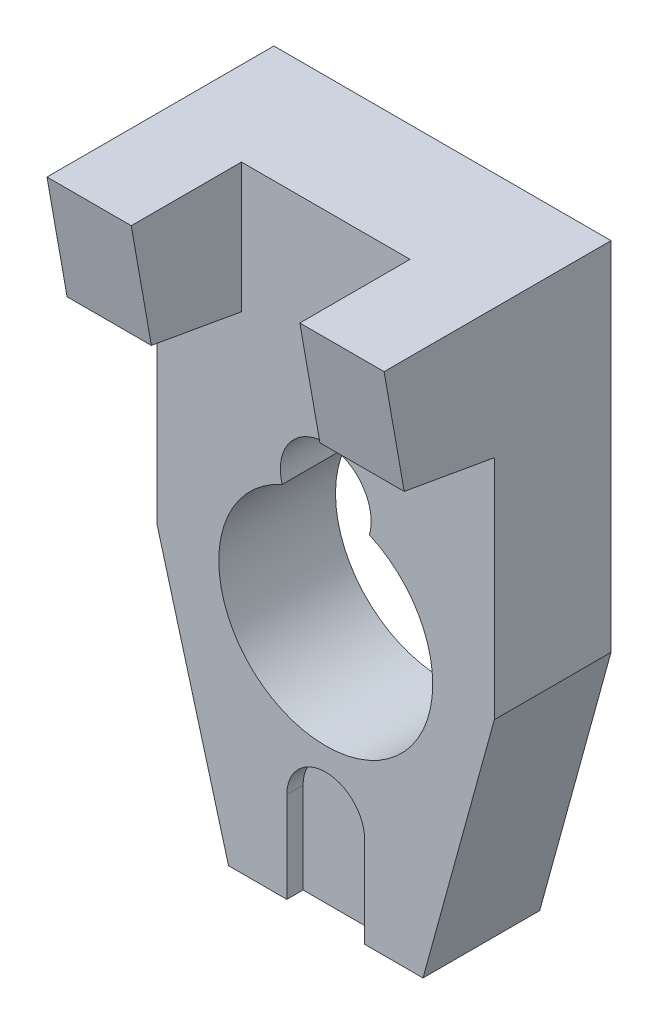
ISO-10303-21;
HEADER;
FILE_DESCRIPTION(('STEP AP214'),'2;1');
FILE_NAME('part.step','',(''),(''),'','','');
FILE_SCHEMA(('AUTOMOTIVE_DESIGN { 1 0 10303 214 1 1 1 1 }'));
ENDSEC;
DATA;
#1=APPLICATION_CONTEXT('core data for automotive mechanical design processes');
#2=APPLICATION_PROTOCOL_DEFINITION('international standard','automotive_design',2000,#1);
#3=PRODUCT_CONTEXT('',#1,'mechanical');
#4=PRODUCT('Part','Part','',(#3));
#5=PRODUCT_RELATED_PRODUCT_CATEGORY('part','',(#4));
#6=PRODUCT_DEFINITION_FORMATION('','',#4);
#7=PRODUCT_DEFINITION_CONTEXT('part definition',#1,'design');
#8=PRODUCT_DEFINITION('design','',#6,#7);
#9=PRODUCT_DEFINITION_SHAPE('','',#8);
#10=(LENGTH_UNIT() NAMED_UNIT(*) SI_UNIT(.MILLI.,.METRE.));
#11=(NAMED_UNIT(*) PLANE_ANGLE_UNIT() SI_UNIT($,.RADIAN.));
#12=(NAMED_UNIT(*) SI_UNIT($,.STERADIAN.) SOLID_ANGLE_UNIT());
#13=UNCERTAINTY_MEASURE_WITH_UNIT(LENGTH_MEASURE(1.E-05),#10,'distance_accuracy_value','');
#14=(GEOMETRIC_REPRESENTATION_CONTEXT(3) GLOBAL_UNCERTAINTY_ASSIGNED_CONTEXT((#13)) GLOBAL_UNIT_ASSIGNED_CONTEXT((#10,
#11,#12)) REPRESENTATION_CONTEXT('',''));
#15=CARTESIAN_POINT('',(0.,0.,0.));
#16=DIRECTION('',(0.,0.,1.));
#17=DIRECTION('',(1.,0.,0.));
#18=AXIS2_PLACEMENT_3D('',#15,#16,#17);
#19=CARTESIAN_POINT('',(0.,0.,18.));
#20=DIRECTION('',(0.,0.,1.));
#21=DIRECTION('',(1.,0.,0.));
#22=AXIS2_PLACEMENT_3D('',#19,#20,#21);
#23=PLANE('',#22);
#24=DIRECTION('',(0.,1.,0.));
#25=VECTOR('',#24,1.);
#26=CARTESIAN_POINT('',(6.,0.,18.));
#27=LINE('',#26,#25);
#28=CARTESIAN_POINT('',(6.00000000000001,-40.,18.));
#29=VERTEX_POINT('',#28);
#30=CARTESIAN_POINT('',(6.00000000000001,-26.,18.));
#31=VERTEX_POINT('',#30);
#32=EDGE_CURVE('E190',#29,#31,#27,.T.);
#33=ORIENTED_EDGE('',*,*,#32,.F.);
#34=DIRECTION('',(1.,0.,0.));
#35=VECTOR('',#34,1.);
#36=CARTESIAN_POINT('',(-15.,-40.,18.));
#37=LINE('',#36,#35);
#38=CARTESIAN_POINT('',(15.,-40.,18.));
#39=VERTEX_POINT('',#38);
#40=EDGE_CURVE('E260',#29,#39,#37,.T.);
#41=ORIENTED_EDGE('',*,*,#40,.T.);
#42=DIRECTION('',(0.265156483021042,0.96420539280379,0.));
#43=VECTOR('',#42,1.);
#44=CARTESIAN_POINT('',(15.,-40.,18.));
#45=LINE('',#44,#43);
#46=CARTESIAN_POINT('',(26.,0.,18.));
#47=VERTEX_POINT('',#46);
#48=EDGE_CURVE('E264',#39,#47,#45,.T.);
#49=ORIENTED_EDGE('',*,*,#48,.T.);
#50=DIRECTION('',(0.,1.,0.));
#51=VECTOR('',#50,1.);
#52=CARTESIAN_POINT('',(26.,55.,18.));
#53=LINE('',#52,#51);
#54=CARTESIAN_POINT('',(26.,35.,18.));
#55=VERTEX_POINT('',#54);
#56=EDGE_CURVE('E266',#47,#55,#53,.T.);
#57=ORIENTED_EDGE('',*,*,#56,.T.);
#58=DIRECTION('',(1.,0.,0.));
#59=VECTOR('',#58,1.);
#60=CARTESIAN_POINT('',(13.,35.,18.));
#61=LINE('',#60,#59);
#62=CARTESIAN_POINT('',(13.,35.,18.));
#63=VERTEX_POINT('',#62);
#64=EDGE_CURVE('E231',#63,#55,#61,.T.);
#65=ORIENTED_EDGE('',*,*,#64,.F.);
#66=DIRECTION('',(0.,1.,0.));
#67=VECTOR('',#66,1.);
#68=CARTESIAN_POINT('',(13.,55.,18.));
#69=LINE('',#68,#67);
#70=CARTESIAN_POINT('',(13.,55.,18.));
#71=VERTEX_POINT('',#70);
#72=EDGE_CURVE('E223',#63,#71,#69,.T.);
#73=ORIENTED_EDGE('',*,*,#72,.T.);
#74=DIRECTION('',(-1.,0.,0.));
#75=VECTOR('',#74,1.);
#76=CARTESIAN_POINT('',(-26.,55.,18.));
#77=LINE('',#76,#75);
#78=CARTESIAN_POINT('',(-13.,55.,18.));
#79=VERTEX_POINT('',#78);
#80=EDGE_CURVE('E269',#71,#79,#77,.T.);
#81=ORIENTED_EDGE('',*,*,#80,.T.);
#82=DIRECTION('',(0.,1.,0.));
#83=VECTOR('',#82,1.);
#84=CARTESIAN_POINT('',(-13.,55.,18.));
#85=LINE('',#84,#83);
#86=CARTESIAN_POINT('',(-13.,35.,18.));
#87=VERTEX_POINT('',#86);
#88=EDGE_CURVE('E64',#87,#79,#85,.T.);
#89=ORIENTED_EDGE('',*,*,#88,.F.);
#90=DIRECTION('',(-1.,0.,0.));
#91=VECTOR('',#90,1.);
#92=CARTESIAN_POINT('',(-13.,35.,18.));
#93=LINE('',#92,#91);
#94=CARTESIAN_POINT('',(-26.,35.,18.));
#95=VERTEX_POINT('',#94);
#96=EDGE_CURVE('E202',#87,#95,#93,.T.);
#97=ORIENTED_EDGE('',*,*,#96,.T.);
#98=DIRECTION('',(0.,-1.,0.));
#99=VECTOR('',#98,1.);
#100=CARTESIAN_POINT('',(-26.,55.,18.));
#101=LINE('',#100,#99);
#102=CARTESIAN_POINT('',(-26.,0.,18.));
#103=VERTEX_POINT('',#102);
#104=EDGE_CURVE('E255',#95,#103,#101,.T.);
#105=ORIENTED_EDGE('',*,*,#104,.T.);
#106=DIRECTION('',(0.265156483021042,-0.96420539280379,0.));
#107=VECTOR('',#106,1.);
#108=CARTESIAN_POINT('',(-26.,0.,18.));
#109=LINE('',#108,#107);
#110=CARTESIAN_POINT('',(-15.,-40.,18.));
#111=VERTEX_POINT('',#110);
#112=EDGE_CURVE('E257',#103,#111,#109,.T.);
#113=ORIENTED_EDGE('',*,*,#112,.T.);
#114=CARTESIAN_POINT('',(-6.,-40.,18.));
#115=VERTEX_POINT('',#114);
#116=EDGE_CURVE('E261',#111,#115,#37,.T.);
#117=ORIENTED_EDGE('',*,*,#116,.T.);
#118=DIRECTION('',(0.,-1.,0.));
#119=VECTOR('',#118,1.);
#120=CARTESIAN_POINT('',(-6.,0.,18.));
#121=LINE('',#120,#119);
#122=CARTESIAN_POINT('',(-6.,-26.,18.));
#123=VERTEX_POINT('',#122);
#124=EDGE_CURVE('E187',#123,#115,#121,.T.);
#125=ORIENTED_EDGE('',*,*,#124,.F.);
#126=CARTESIAN_POINT('',(0.,-26.,18.));
#127=DIRECTION('',(0.,0.,1.));
#128=DIRECTION('',(1.,0.,0.));
#129=AXIS2_PLACEMENT_3D('',#126,#127,#128);
#130=CIRCLE('',#129,6.);
#131=EDGE_CURVE('E11',#31,#123,#130,.T.);
#132=ORIENTED_EDGE('',*,*,#131,.F.);
#133=EDGE_LOOP('',(#33,#41,#49,#57,#65,#73,#81,#89,#97,#105,#113,#117,#125,#132));
#134=FACE_BOUND('',#133,.T.);
#135=CARTESIAN_POINT('',(0.,0.,18.));
#136=DIRECTION('',(0.,0.,1.));
#137=DIRECTION('',(1.,0.,0.));
#138=AXIS2_PLACEMENT_3D('',#135,#136,#137);
#139=CIRCLE('',#138,16.5);
#140=CARTESIAN_POINT('',(-6.72757954669385,15.0661764705882,18.));
#141=VERTEX_POINT('',#140);
#142=CARTESIAN_POINT('',(6.72757954669386,15.0661764705882,18.));
#143=VERTEX_POINT('',#142);
#144=EDGE_CURVE('E241',#141,#143,#139,.T.);
#145=ORIENTED_EDGE('',*,*,#144,.F.);
#146=CARTESIAN_POINT('',(0.,17.,18.));
#147=DIRECTION('',(0.,0.,1.));
#148=DIRECTION('',(1.,0.,0.));
#149=AXIS2_PLACEMENT_3D('',#146,#147,#148);
#150=CIRCLE('',#149,7.);
#151=EDGE_CURVE('E238',#143,#141,#150,.T.);
#152=ORIENTED_EDGE('',*,*,#151,.F.);
#153=EDGE_LOOP('',(#145,#152));
#154=FACE_BOUND('',#153,.T.);
#155=ADVANCED_FACE('F41',(#134,#154),#23,.T.);
#156=CARTESIAN_POINT('',(0.,0.,0.));
#157=DIRECTION('',(0.,0.,1.));
#158=DIRECTION('',(1.,0.,0.));
#159=AXIS2_PLACEMENT_3D('',#156,#157,#158);
#160=PLANE('',#159);
#161=DIRECTION('',(0.,-1.,0.));
#162=VECTOR('',#161,1.);
#163=CARTESIAN_POINT('',(-26.,55.,0.));
#164=LINE('',#163,#162);
#165=CARTESIAN_POINT('',(-26.,55.,0.));
#166=VERTEX_POINT('',#165);
#167=CARTESIAN_POINT('',(-26.,0.,0.));
#168=VERTEX_POINT('',#167);
#169=EDGE_CURVE('E254',#166,#168,#164,.T.);
#170=ORIENTED_EDGE('',*,*,#169,.F.);
#171=DIRECTION('',(-1.,0.,0.));
#172=VECTOR('',#171,1.);
#173=CARTESIAN_POINT('',(-26.,55.,0.));
#174=LINE('',#173,#172);
#175=CARTESIAN_POINT('',(26.,55.,0.));
#176=VERTEX_POINT('',#175);
#177=EDGE_CURVE('E258',#176,#166,#174,.T.);
#178=ORIENTED_EDGE('',*,*,#177,.F.);
#179=DIRECTION('',(0.,1.,0.));
#180=VECTOR('',#179,1.);
#181=CARTESIAN_POINT('',(26.,55.,0.));
#182=LINE('',#181,#180);
#183=CARTESIAN_POINT('',(26.,0.,0.));
#184=VERTEX_POINT('',#183);
#185=EDGE_CURVE('E280',#184,#176,#182,.T.);
#186=ORIENTED_EDGE('',*,*,#185,.F.);
#187=DIRECTION('',(0.265156483021042,0.96420539280379,0.));
#188=VECTOR('',#187,1.);
#189=CARTESIAN_POINT('',(15.,-40.,0.));
#190=LINE('',#189,#188);
#191=CARTESIAN_POINT('',(15.,-40.,0.));
#192=VERTEX_POINT('',#191);
#193=EDGE_CURVE('E278',#192,#184,#190,.T.);
#194=ORIENTED_EDGE('',*,*,#193,.F.);
#195=DIRECTION('',(1.,0.,0.));
#196=VECTOR('',#195,1.);
#197=CARTESIAN_POINT('',(-15.,-40.,0.));
#198=LINE('',#197,#196);
#199=CARTESIAN_POINT('',(-15.,-40.,0.));
#200=VERTEX_POINT('',#199);
#201=EDGE_CURVE('E276',#200,#192,#198,.T.);
#202=ORIENTED_EDGE('',*,*,#201,.F.);
#203=DIRECTION('',(0.265156483021042,-0.96420539280379,0.));
#204=VECTOR('',#203,1.);
#205=CARTESIAN_POINT('',(-26.,0.,0.));
#206=LINE('',#205,#204);
#207=EDGE_CURVE('E274',#168,#200,#206,.T.);
#208=ORIENTED_EDGE('',*,*,#207,.F.);
#209=EDGE_LOOP('',(#170,#178,#186,#194,#202,#208));
#210=FACE_BOUND('',#209,.T.);
#211=CARTESIAN_POINT('',(0.,17.,0.));
#212=DIRECTION('',(0.,0.,1.));
#213=DIRECTION('',(1.,0.,0.));
#214=AXIS2_PLACEMENT_3D('',#211,#212,#213);
#215=CIRCLE('',#214,7.);
#216=CARTESIAN_POINT('',(6.72757954669386,15.0661764705882,0.));
#217=VERTEX_POINT('',#216);
#218=CARTESIAN_POINT('',(-6.72757954669385,15.0661764705882,0.));
#219=VERTEX_POINT('',#218);
#220=EDGE_CURVE('E233',#217,#219,#215,.T.);
#221=ORIENTED_EDGE('',*,*,#220,.T.);
#222=CARTESIAN_POINT('',(0.,0.,0.));
#223=DIRECTION('',(0.,0.,1.));
#224=DIRECTION('',(1.,0.,0.));
#225=AXIS2_PLACEMENT_3D('',#222,#223,#224);
#226=CIRCLE('',#225,16.5);
#227=EDGE_CURVE('E242',#219,#217,#226,.T.);
#228=ORIENTED_EDGE('',*,*,#227,.T.);
#229=EDGE_LOOP('',(#221,#228));
#230=FACE_BOUND('',#229,.T.);
#231=ADVANCED_FACE('F319',(#210,#230),#160,.F.);
#232=CARTESIAN_POINT('',(-26.,55.,18.));
#233=DIRECTION('',(1.,0.,0.));
#234=DIRECTION('',(0.,1.,0.));
#235=AXIS2_PLACEMENT_3D('',#232,#233,#234);
#236=PLANE('',#235);
#237=ORIENTED_EDGE('',*,*,#169,.T.);
#238=DIRECTION('',(0.,0.,-1.));
#239=VECTOR('',#238,1.);
#240=CARTESIAN_POINT('',(-26.,0.,18.));
#241=LINE('',#240,#239);
#242=EDGE_CURVE('E297',#103,#168,#241,.T.);
#243=ORIENTED_EDGE('',*,*,#242,.F.);
#244=ORIENTED_EDGE('',*,*,#104,.F.);
#245=DIRECTION('',(0.,-0.173648177666924,-0.984807753012209));
#246=VECTOR('',#245,1.);
#247=CARTESIAN_POINT('',(-26.,35.,18.));
#248=LINE('',#247,#246);
#249=CARTESIAN_POINT('',(-26.,37.4519692665035,31.9058087233833));
#250=VERTEX_POINT('',#249);
#251=EDGE_CURVE('E192',#250,#95,#248,.T.);
#252=ORIENTED_EDGE('',*,*,#251,.F.);
#253=DIRECTION('',(0.,-0.984807753012209,-0.173648177666925));
#254=VECTOR('',#253,1.);
#255=CARTESIAN_POINT('',(-26.,37.4519692665035,31.9058087233833));
#256=LINE('',#255,#254);
#257=CARTESIAN_POINT('',(-26.,55.,35.));
#258=VERTEX_POINT('',#257);
#259=EDGE_CURVE('E196',#258,#250,#256,.T.);
#260=ORIENTED_EDGE('',*,*,#259,.F.);
#261=DIRECTION('',(0.,0.,-1.));
#262=VECTOR('',#261,1.);
#263=CARTESIAN_POINT('',(-26.,55.,18.));
#264=LINE('',#263,#262);
#265=EDGE_CURVE('E271',#258,#166,#264,.T.);
#266=ORIENTED_EDGE('',*,*,#265,.T.);
#267=EDGE_LOOP('',(#237,#243,#244,#252,#260,#266));
#268=FACE_BOUND('',#267,.T.);
#269=ADVANCED_FACE('F43',(#268),#236,.F.);
#270=CARTESIAN_POINT('',(-26.,0.,18.));
#271=DIRECTION('',(0.96420539280379,0.265156483021042,0.));
#272=DIRECTION('',(-0.265156483021042,0.96420539280379,0.));
#273=AXIS2_PLACEMENT_3D('',#270,#271,#272);
#274=PLANE('',#273);
#275=ORIENTED_EDGE('',*,*,#207,.T.);
#276=DIRECTION('',(0.,0.,-1.));
#277=VECTOR('',#276,1.);
#278=CARTESIAN_POINT('',(-15.,-40.,18.));
#279=LINE('',#278,#277);
#280=EDGE_CURVE('E294',#111,#200,#279,.T.);
#281=ORIENTED_EDGE('',*,*,#280,.F.);
#282=ORIENTED_EDGE('',*,*,#112,.F.);
#283=ORIENTED_EDGE('',*,*,#242,.T.);
#284=EDGE_LOOP('',(#275,#281,#282,#283));
#285=FACE_BOUND('',#284,.T.);
#286=ADVANCED_FACE('F357',(#285),#274,.F.);
#287=CARTESIAN_POINT('',(-15.,-40.,18.));
#288=DIRECTION('',(0.,1.,0.));
#289=DIRECTION('',(0.,0.,1.));
#290=AXIS2_PLACEMENT_3D('',#287,#288,#289);
#291=PLANE('',#290);
#292=ORIENTED_EDGE('',*,*,#40,.F.);
#293=DIRECTION('',(0.,0.,-1.));
#294=VECTOR('',#293,1.);
#295=CARTESIAN_POINT('',(6.00000000000001,-40.,18.));
#296=LINE('',#295,#294);
#297=CARTESIAN_POINT('',(6.00000000000001,-40.,15.5));
#298=VERTEX_POINT('',#297);
#299=EDGE_CURVE('E49',#29,#298,#296,.T.);
#300=ORIENTED_EDGE('',*,*,#299,.T.);
#301=DIRECTION('',(1.,0.,0.));
#302=VECTOR('',#301,1.);
#303=CARTESIAN_POINT('',(-15.,-40.,15.5));
#304=LINE('',#303,#302);
#305=CARTESIAN_POINT('',(-6.,-40.,15.5));
#306=VERTEX_POINT('',#305);
#307=EDGE_CURVE('E300',#306,#298,#304,.T.);
#308=ORIENTED_EDGE('',*,*,#307,.F.);
#309=DIRECTION('',(0.,0.,1.));
#310=VECTOR('',#309,1.);
#311=CARTESIAN_POINT('',(-6.,-40.,18.));
#312=LINE('',#311,#310);
#313=EDGE_CURVE('E178',#306,#115,#312,.T.);
#314=ORIENTED_EDGE('',*,*,#313,.T.);
#315=ORIENTED_EDGE('',*,*,#116,.F.);
#316=ORIENTED_EDGE('',*,*,#280,.T.);
#317=ORIENTED_EDGE('',*,*,#201,.T.);
#318=DIRECTION('',(0.,0.,-1.));
#319=VECTOR('',#318,1.);
#320=CARTESIAN_POINT('',(15.,-40.,18.));
#321=LINE('',#320,#319);
#322=EDGE_CURVE('E291',#39,#192,#321,.T.);
#323=ORIENTED_EDGE('',*,*,#322,.F.);
#324=EDGE_LOOP('',(#292,#300,#308,#314,#315,#316,#317,#323));
#325=FACE_BOUND('',#324,.T.);
#326=ADVANCED_FACE('F305',(#325),#291,.F.);
#327=CARTESIAN_POINT('',(15.,-40.,18.));
#328=DIRECTION('',(-0.96420539280379,0.265156483021042,0.));
#329=DIRECTION('',(-0.265156483021042,-0.96420539280379,0.));
#330=AXIS2_PLACEMENT_3D('',#327,#328,#329);
#331=PLANE('',#330);
#332=ORIENTED_EDGE('',*,*,#193,.T.);
#333=DIRECTION('',(0.,0.,-1.));
#334=VECTOR('',#333,1.);
#335=CARTESIAN_POINT('',(26.,0.,18.));
#336=LINE('',#335,#334);
#337=EDGE_CURVE('E288',#47,#184,#336,.T.);
#338=ORIENTED_EDGE('',*,*,#337,.F.);
#339=ORIENTED_EDGE('',*,*,#48,.F.);
#340=ORIENTED_EDGE('',*,*,#322,.T.);
#341=EDGE_LOOP('',(#332,#338,#339,#340));
#342=FACE_BOUND('',#341,.T.);
#343=ADVANCED_FACE('F325',(#342),#331,.F.);
#344=CARTESIAN_POINT('',(26.,55.,18.));
#345=DIRECTION('',(-1.,0.,0.));
#346=DIRECTION('',(0.,-1.,0.));
#347=AXIS2_PLACEMENT_3D('',#344,#345,#346);
#348=PLANE('',#347);
#349=ORIENTED_EDGE('',*,*,#185,.T.);
#350=DIRECTION('',(0.,0.,-1.));
#351=VECTOR('',#350,1.);
#352=CARTESIAN_POINT('',(26.,55.,18.));
#353=LINE('',#352,#351);
#354=CARTESIAN_POINT('',(26.,55.,35.));
#355=VERTEX_POINT('',#354);
#356=EDGE_CURVE('E285',#355,#176,#353,.T.);
#357=ORIENTED_EDGE('',*,*,#356,.F.);
#358=DIRECTION('',(0.,-0.984807753012209,-0.173648177666925));
#359=VECTOR('',#358,1.);
#360=CARTESIAN_POINT('',(26.,37.4519692665035,31.9058087233833));
#361=LINE('',#360,#359);
#362=CARTESIAN_POINT('',(26.,37.4519692665035,31.9058087233833));
#363=VERTEX_POINT('',#362);
#364=EDGE_CURVE('E209',#355,#363,#361,.T.);
#365=ORIENTED_EDGE('',*,*,#364,.T.);
#366=DIRECTION('',(0.,-0.173648177666924,-0.984807753012209));
#367=VECTOR('',#366,1.);
#368=CARTESIAN_POINT('',(26.,35.,18.));
#369=LINE('',#368,#367);
#370=EDGE_CURVE('E218',#363,#55,#369,.T.);
#371=ORIENTED_EDGE('',*,*,#370,.T.);
#372=ORIENTED_EDGE('',*,*,#56,.F.);
#373=ORIENTED_EDGE('',*,*,#337,.T.);
#374=EDGE_LOOP('',(#349,#357,#365,#371,#372,#373));
#375=FACE_BOUND('',#374,.T.);
#376=ADVANCED_FACE('F329',(#375),#348,.F.);
#377=CARTESIAN_POINT('',(-26.,55.,18.));
#378=DIRECTION('',(0.,-1.,0.));
#379=DIRECTION('',(0.,0.,-1.));
#380=AXIS2_PLACEMENT_3D('',#377,#378,#379);
#381=PLANE('',#380);
#382=ORIENTED_EDGE('',*,*,#177,.T.);
#383=ORIENTED_EDGE('',*,*,#265,.F.);
#384=DIRECTION('',(-1.,0.,0.));
#385=VECTOR('',#384,1.);
#386=CARTESIAN_POINT('',(-13.,55.,35.));
#387=LINE('',#386,#385);
#388=CARTESIAN_POINT('',(-13.,55.,35.));
#389=VERTEX_POINT('',#388);
#390=EDGE_CURVE('E206',#389,#258,#387,.T.);
#391=ORIENTED_EDGE('',*,*,#390,.F.);
#392=DIRECTION('',(0.,0.,1.));
#393=VECTOR('',#392,1.);
#394=CARTESIAN_POINT('',(-13.,55.,35.));
#395=LINE('',#394,#393);
#396=EDGE_CURVE('E193',#79,#389,#395,.T.);
#397=ORIENTED_EDGE('',*,*,#396,.F.);
#398=ORIENTED_EDGE('',*,*,#80,.F.);
#399=DIRECTION('',(0.,0.,1.));
#400=VECTOR('',#399,1.);
#401=CARTESIAN_POINT('',(13.,55.,35.));
#402=LINE('',#401,#400);
#403=CARTESIAN_POINT('',(13.,55.,35.));
#404=VERTEX_POINT('',#403);
#405=EDGE_CURVE('E214',#71,#404,#402,.T.);
#406=ORIENTED_EDGE('',*,*,#405,.T.);
#407=DIRECTION('',(1.,0.,0.));
#408=VECTOR('',#407,1.);
#409=CARTESIAN_POINT('',(13.,55.,35.));
#410=LINE('',#409,#408);
#411=EDGE_CURVE('E226',#404,#355,#410,.T.);
#412=ORIENTED_EDGE('',*,*,#411,.T.);
#413=ORIENTED_EDGE('',*,*,#356,.T.);
#414=EDGE_LOOP('',(#382,#383,#391,#397,#398,#406,#412,#413));
#415=FACE_BOUND('',#414,.T.);
#416=ADVANCED_FACE('F341',(#415),#381,.F.);
#417=CARTESIAN_POINT('',(0.,17.,18.));
#418=DIRECTION('',(0.,0.,-1.));
#419=DIRECTION('',(-1.,0.,0.));
#420=AXIS2_PLACEMENT_3D('',#417,#418,#419);
#421=CYLINDRICAL_SURFACE('',#420,7.);
#422=ORIENTED_EDGE('',*,*,#220,.F.);
#423=DIRECTION('',(0.,0.,-1.));
#424=VECTOR('',#423,1.);
#425=CARTESIAN_POINT('',(6.72757954669386,15.0661764705882,18.));
#426=LINE('',#425,#424);
#427=EDGE_CURVE('E244',#143,#217,#426,.T.);
#428=ORIENTED_EDGE('',*,*,#427,.F.);
#429=ORIENTED_EDGE('',*,*,#151,.T.);
#430=DIRECTION('',(0.,0.,-1.));
#431=VECTOR('',#430,1.);
#432=CARTESIAN_POINT('',(-6.72757954669385,15.0661764705882,18.));
#433=LINE('',#432,#431);
#434=EDGE_CURVE('E251',#141,#219,#433,.T.);
#435=ORIENTED_EDGE('',*,*,#434,.T.);
#436=EDGE_LOOP('',(#422,#428,#429,#435));
#437=FACE_BOUND('',#436,.T.);
#438=ADVANCED_FACE('F373',(#437),#421,.F.);
#439=CARTESIAN_POINT('',(0.,0.,18.));
#440=DIRECTION('',(0.,0.,-1.));
#441=DIRECTION('',(-1.,0.,0.));
#442=AXIS2_PLACEMENT_3D('',#439,#440,#441);
#443=CYLINDRICAL_SURFACE('',#442,16.5);
#444=ORIENTED_EDGE('',*,*,#227,.F.);
#445=ORIENTED_EDGE('',*,*,#434,.F.);
#446=ORIENTED_EDGE('',*,*,#144,.T.);
#447=ORIENTED_EDGE('',*,*,#427,.T.);
#448=EDGE_LOOP('',(#444,#445,#446,#447));
#449=FACE_BOUND('',#448,.T.);
#450=ADVANCED_FACE('F391',(#449),#443,.F.);
#451=CARTESIAN_POINT('',(13.,35.,18.));
#452=DIRECTION('',(0.,-0.984807753012209,0.173648177666924));
#453=DIRECTION('',(0.,-0.173648177666924,-0.984807753012209));
#454=AXIS2_PLACEMENT_3D('',#451,#452,#453);
#455=PLANE('',#454);
#456=ORIENTED_EDGE('',*,*,#370,.F.);
#457=DIRECTION('',(1.,0.,0.));
#458=VECTOR('',#457,1.);
#459=CARTESIAN_POINT('',(13.,37.4519692665035,31.9058087233833));
#460=LINE('',#459,#458);
#461=CARTESIAN_POINT('',(13.,37.4519692665035,31.9058087233833));
#462=VERTEX_POINT('',#461);
#463=EDGE_CURVE('E234',#462,#363,#460,.T.);
#464=ORIENTED_EDGE('',*,*,#463,.F.);
#465=DIRECTION('',(0.,-0.173648177666924,-0.984807753012209));
#466=VECTOR('',#465,1.);
#467=CARTESIAN_POINT('',(13.,35.,18.));
#468=LINE('',#467,#466);
#469=EDGE_CURVE('E221',#462,#63,#468,.T.);
#470=ORIENTED_EDGE('',*,*,#469,.T.);
#471=ORIENTED_EDGE('',*,*,#64,.T.);
#472=EDGE_LOOP('',(#456,#464,#470,#471));
#473=FACE_BOUND('',#472,.T.);
#474=ADVANCED_FACE('F335',(#473),#455,.T.);
#475=CARTESIAN_POINT('',(13.,37.4519692665035,31.9058087233833));
#476=DIRECTION('',(0.,-0.173648177666924,0.984807753012209));
#477=DIRECTION('',(0.,-0.984807753012209,-0.173648177666925));
#478=AXIS2_PLACEMENT_3D('',#475,#476,#477);
#479=PLANE('',#478);
#480=ORIENTED_EDGE('',*,*,#364,.F.);
#481=ORIENTED_EDGE('',*,*,#411,.F.);
#482=DIRECTION('',(0.,-0.984807753012209,-0.173648177666925));
#483=VECTOR('',#482,1.);
#484=CARTESIAN_POINT('',(13.,37.4519692665035,31.9058087233833));
#485=LINE('',#484,#483);
#486=EDGE_CURVE('E217',#404,#462,#485,.T.);
#487=ORIENTED_EDGE('',*,*,#486,.T.);
#488=ORIENTED_EDGE('',*,*,#463,.T.);
#489=EDGE_LOOP('',(#480,#481,#487,#488));
#490=FACE_BOUND('',#489,.T.);
#491=ADVANCED_FACE('F412',(#490),#479,.T.);
#492=CARTESIAN_POINT('',(13.,0.,0.));
#493=DIRECTION('',(-1.,0.,0.));
#494=DIRECTION('',(0.,-1.,0.));
#495=AXIS2_PLACEMENT_3D('',#492,#493,#494);
#496=PLANE('',#495);
#497=ORIENTED_EDGE('',*,*,#405,.F.);
#498=ORIENTED_EDGE('',*,*,#72,.F.);
#499=ORIENTED_EDGE('',*,*,#469,.F.);
#500=ORIENTED_EDGE('',*,*,#486,.F.);
#501=EDGE_LOOP('',(#497,#498,#499,#500));
#502=FACE_BOUND('',#501,.T.);
#503=ADVANCED_FACE('F339',(#502),#496,.T.);
#504=CARTESIAN_POINT('',(-13.,37.4519692665035,31.9058087233833));
#505=DIRECTION('',(0.,0.173648177666924,-0.984807753012209));
#506=DIRECTION('',(0.,0.984807753012209,0.173648177666925));
#507=AXIS2_PLACEMENT_3D('',#504,#505,#506);
#508=PLANE('',#507);
#509=ORIENTED_EDGE('',*,*,#259,.T.);
#510=DIRECTION('',(-1.,0.,0.));
#511=VECTOR('',#510,1.);
#512=CARTESIAN_POINT('',(-13.,37.4519692665035,31.9058087233833));
#513=LINE('',#512,#511);
#514=CARTESIAN_POINT('',(-13.,37.4519692665035,31.9058087233833));
#515=VERTEX_POINT('',#514);
#516=EDGE_CURVE('E210',#515,#250,#513,.T.);
#517=ORIENTED_EDGE('',*,*,#516,.F.);
#518=DIRECTION('',(0.,-0.984807753012209,-0.173648177666925));
#519=VECTOR('',#518,1.);
#520=CARTESIAN_POINT('',(-13.,37.4519692665035,31.9058087233833));
#521=LINE('',#520,#519);
#522=EDGE_CURVE('E200',#389,#515,#521,.T.);
#523=ORIENTED_EDGE('',*,*,#522,.F.);
#524=ORIENTED_EDGE('',*,*,#390,.T.);
#525=EDGE_LOOP('',(#509,#517,#523,#524));
#526=FACE_BOUND('',#525,.T.);
#527=ADVANCED_FACE('F427',(#526),#508,.F.);
#528=CARTESIAN_POINT('',(-13.,35.,18.));
#529=DIRECTION('',(0.,0.984807753012209,-0.173648177666924));
#530=DIRECTION('',(0.,0.173648177666924,0.984807753012209));
#531=AXIS2_PLACEMENT_3D('',#528,#529,#530);
#532=PLANE('',#531);
#533=ORIENTED_EDGE('',*,*,#251,.T.);
#534=ORIENTED_EDGE('',*,*,#96,.F.);
#535=DIRECTION('',(0.,-0.173648177666924,-0.984807753012209));
#536=VECTOR('',#535,1.);
#537=CARTESIAN_POINT('',(-13.,35.,18.));
#538=LINE('',#537,#536);
#539=EDGE_CURVE('E198',#515,#87,#538,.T.);
#540=ORIENTED_EDGE('',*,*,#539,.F.);
#541=ORIENTED_EDGE('',*,*,#516,.T.);
#542=EDGE_LOOP('',(#533,#534,#540,#541));
#543=FACE_BOUND('',#542,.T.);
#544=ADVANCED_FACE('F351',(#543),#532,.F.);
#545=CARTESIAN_POINT('',(-13.,0.,0.));
#546=DIRECTION('',(1.,0.,0.));
#547=DIRECTION('',(0.,-1.,0.));
#548=AXIS2_PLACEMENT_3D('',#545,#546,#547);
#549=PLANE('',#548);
#550=ORIENTED_EDGE('',*,*,#396,.T.);
#551=ORIENTED_EDGE('',*,*,#522,.T.);
#552=ORIENTED_EDGE('',*,*,#539,.T.);
#553=ORIENTED_EDGE('',*,*,#88,.T.);
#554=EDGE_LOOP('',(#550,#551,#552,#553));
#555=FACE_BOUND('',#554,.T.);
#556=ADVANCED_FACE('F346',(#555),#549,.T.);
#557=CARTESIAN_POINT('',(0.,-26.,15.5));
#558=DIRECTION('',(0.,0.,1.));
#559=DIRECTION('',(1.,0.,0.));
#560=AXIS2_PLACEMENT_3D('',#557,#558,#559);
#561=PLANE('',#560);
#562=ORIENTED_EDGE('',*,*,#307,.T.);
#563=DIRECTION('',(0.,1.,0.));
#564=VECTOR('',#563,1.);
#565=CARTESIAN_POINT('',(6.00000000000001,-26.,15.5));
#566=LINE('',#565,#564);
#567=CARTESIAN_POINT('',(6.00000000000001,-26.,15.5));
#568=VERTEX_POINT('',#567);
#569=EDGE_CURVE('E174',#298,#568,#566,.T.);
#570=ORIENTED_EDGE('',*,*,#569,.T.);
#571=CARTESIAN_POINT('',(0.,-26.,15.5));
#572=DIRECTION('',(0.,0.,1.));
#573=DIRECTION('',(1.,0.,0.));
#574=AXIS2_PLACEMENT_3D('',#571,#572,#573);
#575=CIRCLE('',#574,6.);
#576=CARTESIAN_POINT('',(-6.,-26.,15.5));
#577=VERTEX_POINT('',#576);
#578=EDGE_CURVE('E169',#568,#577,#575,.T.);
#579=ORIENTED_EDGE('',*,*,#578,.T.);
#580=DIRECTION('',(0.,-1.,0.));
#581=VECTOR('',#580,1.);
#582=CARTESIAN_POINT('',(-6.,-26.,15.5));
#583=LINE('',#582,#581);
#584=EDGE_CURVE('E56',#577,#306,#583,.T.);
#585=ORIENTED_EDGE('',*,*,#584,.T.);
#586=EDGE_LOOP('',(#562,#570,#579,#585));
#587=FACE_BOUND('',#586,.T.);
#588=ADVANCED_FACE('F181',(#587),#561,.T.);
#589=CARTESIAN_POINT('',(0.,-26.,15.5));
#590=DIRECTION('',(0.,0.,1.));
#591=DIRECTION('',(1.,0.,0.));
#592=AXIS2_PLACEMENT_3D('',#589,#590,#591);
#593=CYLINDRICAL_SURFACE('',#592,6.);
#594=ORIENTED_EDGE('',*,*,#131,.T.);
#595=DIRECTION('',(0.,0.,1.));
#596=VECTOR('',#595,1.);
#597=CARTESIAN_POINT('',(-6.,-26.,15.5));
#598=LINE('',#597,#596);
#599=EDGE_CURVE('E166',#577,#123,#598,.T.);
#600=ORIENTED_EDGE('',*,*,#599,.F.);
#601=ORIENTED_EDGE('',*,*,#578,.F.);
#602=DIRECTION('',(0.,0.,1.));
#603=VECTOR('',#602,1.);
#604=CARTESIAN_POINT('',(6.00000000000001,-26.,15.5));
#605=LINE('',#604,#603);
#606=EDGE_CURVE('E173',#568,#31,#605,.T.);
#607=ORIENTED_EDGE('',*,*,#606,.T.);
#608=EDGE_LOOP('',(#594,#600,#601,#607));
#609=FACE_BOUND('',#608,.T.);
#610=ADVANCED_FACE('F167',(#609),#593,.F.);
#611=CARTESIAN_POINT('',(6.00000000000001,-26.,15.5));
#612=DIRECTION('',(1.,0.,0.));
#613=DIRECTION('',(0.,1.,0.));
#614=AXIS2_PLACEMENT_3D('',#611,#612,#613);
#615=PLANE('',#614);
#616=ORIENTED_EDGE('',*,*,#32,.T.);
#617=ORIENTED_EDGE('',*,*,#606,.F.);
#618=ORIENTED_EDGE('',*,*,#569,.F.);
#619=ORIENTED_EDGE('',*,*,#299,.F.);
#620=EDGE_LOOP('',(#616,#617,#618,#619));
#621=FACE_BOUND('',#620,.T.);
#622=ADVANCED_FACE('F309',(#621),#615,.F.);
#623=CARTESIAN_POINT('',(-6.,-26.,15.5));
#624=DIRECTION('',(-1.,0.,0.));
#625=DIRECTION('',(0.,-1.,0.));
#626=AXIS2_PLACEMENT_3D('',#623,#624,#625);
#627=PLANE('',#626);
#628=ORIENTED_EDGE('',*,*,#124,.T.);
#629=ORIENTED_EDGE('',*,*,#313,.F.);
#630=ORIENTED_EDGE('',*,*,#584,.F.);
#631=ORIENTED_EDGE('',*,*,#599,.T.);
#632=EDGE_LOOP('',(#628,#629,#630,#631));
#633=FACE_BOUND('',#632,.T.);
#634=ADVANCED_FACE('F176',(#633),#627,.F.);
#635=CLOSED_SHELL('',(#155,#231,#269,#286,#326,#343,#376,#416,#438,#450,#474,#491,#503,#527,
#544,#556,#588,#610,#622,#634));
#636=MANIFOLD_SOLID_BREP('B2',#635);
#637=ADVANCED_BREP_SHAPE_REPRESENTATION('',(#18,#636),#14);
#638=SHAPE_DEFINITION_REPRESENTATION(#9,#637);
ENDSEC;
END-ISO-10303-21;
